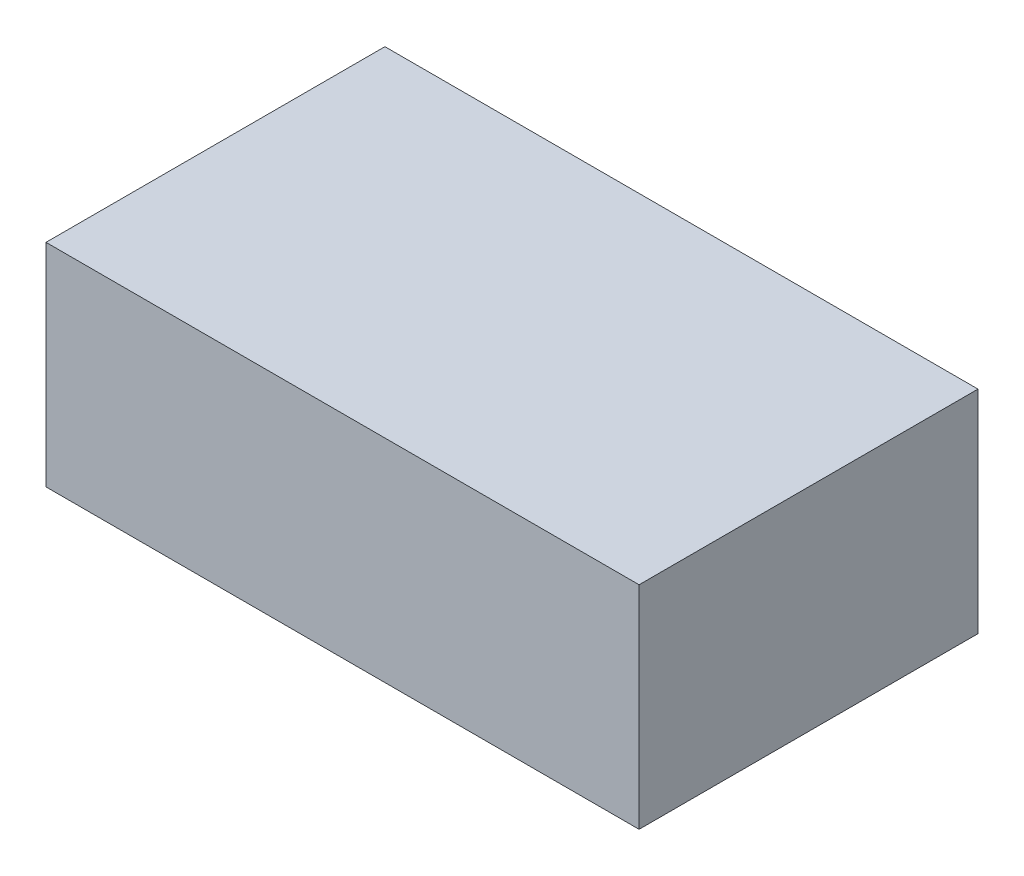
ISO-10303-21;
HEADER;
FILE_DESCRIPTION(('STEP AP214'),'2;1');
FILE_NAME('part.step','',(''),(''),'','','');
FILE_SCHEMA(('AUTOMOTIVE_DESIGN { 1 0 10303 214 1 1 1 1 }'));
ENDSEC;
DATA;
#1=APPLICATION_CONTEXT('core data for automotive mechanical design processes');
#2=APPLICATION_PROTOCOL_DEFINITION('international standard','automotive_design',2000,#1);
#3=PRODUCT_CONTEXT('',#1,'mechanical');
#4=PRODUCT('Part','Part','',(#3));
#5=PRODUCT_RELATED_PRODUCT_CATEGORY('part','',(#4));
#6=PRODUCT_DEFINITION_FORMATION('','',#4);
#7=PRODUCT_DEFINITION_CONTEXT('part definition',#1,'design');
#8=PRODUCT_DEFINITION('design','',#6,#7);
#9=PRODUCT_DEFINITION_SHAPE('','',#8);
#10=(LENGTH_UNIT() NAMED_UNIT(*) SI_UNIT(.MILLI.,.METRE.));
#11=(NAMED_UNIT(*) PLANE_ANGLE_UNIT() SI_UNIT($,.RADIAN.));
#12=(NAMED_UNIT(*) SI_UNIT($,.STERADIAN.) SOLID_ANGLE_UNIT());
#13=UNCERTAINTY_MEASURE_WITH_UNIT(LENGTH_MEASURE(1.E-05),#10,'distance_accuracy_value','');
#14=(GEOMETRIC_REPRESENTATION_CONTEXT(3) GLOBAL_UNCERTAINTY_ASSIGNED_CONTEXT((#13)) GLOBAL_UNIT_ASSIGNED_CONTEXT((#10,
#11,#12)) REPRESENTATION_CONTEXT('',''));
#15=CARTESIAN_POINT('',(0.,0.,0.));
#16=DIRECTION('',(0.,0.,1.));
#17=DIRECTION('',(1.,0.,0.));
#18=AXIS2_PLACEMENT_3D('',#15,#16,#17);
#19=CARTESIAN_POINT('',(0.,15.875,0.));
#20=DIRECTION('',(-1.,0.,0.));
#21=DIRECTION('',(0.,0.,1.));
#22=AXIS2_PLACEMENT_3D('',#19,#20,#21);
#23=PLANE('',#22);
#24=DIRECTION('',(0.,0.,-1.));
#25=VECTOR('',#24,1.);
#26=CARTESIAN_POINT('',(0.,0.,0.));
#27=LINE('',#26,#25);
#28=CARTESIAN_POINT('',(0.,0.,0.));
#29=VERTEX_POINT('',#28);
#30=CARTESIAN_POINT('',(0.,0.,-25.4));
#31=VERTEX_POINT('',#30);
#32=EDGE_CURVE('E100',#29,#31,#27,.T.);
#33=ORIENTED_EDGE('',*,*,#32,.T.);
#34=DIRECTION('',(0.,-1.,0.));
#35=VECTOR('',#34,1.);
#36=CARTESIAN_POINT('',(0.,15.875,-25.4));
#37=LINE('',#36,#35);
#38=CARTESIAN_POINT('',(0.,15.875,-25.4));
#39=VERTEX_POINT('',#38);
#40=EDGE_CURVE('E11',#39,#31,#37,.T.);
#41=ORIENTED_EDGE('',*,*,#40,.F.);
#42=DIRECTION('',(0.,0.,-1.));
#43=VECTOR('',#42,1.);
#44=CARTESIAN_POINT('',(0.,15.875,0.));
#45=LINE('',#44,#43);
#46=CARTESIAN_POINT('',(0.,15.875,0.));
#47=VERTEX_POINT('',#46);
#48=EDGE_CURVE('E88',#47,#39,#45,.T.);
#49=ORIENTED_EDGE('',*,*,#48,.F.);
#50=DIRECTION('',(0.,-1.,0.));
#51=VECTOR('',#50,1.);
#52=CARTESIAN_POINT('',(0.,15.875,0.));
#53=LINE('',#52,#51);
#54=EDGE_CURVE('E96',#47,#29,#53,.T.);
#55=ORIENTED_EDGE('',*,*,#54,.T.);
#56=EDGE_LOOP('',(#33,#41,#49,#55));
#57=FACE_BOUND('',#56,.T.);
#58=ADVANCED_FACE('F37',(#57),#23,.F.);
#59=CARTESIAN_POINT('',(0.,15.875,-25.4));
#60=DIRECTION('',(0.,0.,1.));
#61=DIRECTION('',(1.,0.,0.));
#62=AXIS2_PLACEMENT_3D('',#59,#60,#61);
#63=PLANE('',#62);
#64=DIRECTION('',(-1.,0.,0.));
#65=VECTOR('',#64,1.);
#66=CARTESIAN_POINT('',(0.,0.,-25.4));
#67=LINE('',#66,#65);
#68=CARTESIAN_POINT('',(-44.45,0.,-25.4));
#69=VERTEX_POINT('',#68);
#70=EDGE_CURVE('E92',#31,#69,#67,.T.);
#71=ORIENTED_EDGE('',*,*,#70,.T.);
#72=DIRECTION('',(0.,-1.,0.));
#73=VECTOR('',#72,1.);
#74=CARTESIAN_POINT('',(-44.45,15.875,-25.4));
#75=LINE('',#74,#73);
#76=CARTESIAN_POINT('',(-44.45,15.875,-25.4));
#77=VERTEX_POINT('',#76);
#78=EDGE_CURVE('E45',#77,#69,#75,.T.);
#79=ORIENTED_EDGE('',*,*,#78,.F.);
#80=DIRECTION('',(-1.,0.,0.));
#81=VECTOR('',#80,1.);
#82=CARTESIAN_POINT('',(0.,15.875,-25.4));
#83=LINE('',#82,#81);
#84=EDGE_CURVE('E83',#39,#77,#83,.T.);
#85=ORIENTED_EDGE('',*,*,#84,.F.);
#86=ORIENTED_EDGE('',*,*,#40,.T.);
#87=EDGE_LOOP('',(#71,#79,#85,#86));
#88=FACE_BOUND('',#87,.T.);
#89=ADVANCED_FACE('F91',(#88),#63,.F.);
#90=CARTESIAN_POINT('',(-44.45,15.875,0.));
#91=DIRECTION('',(1.,0.,0.));
#92=DIRECTION('',(0.,0.,-1.));
#93=AXIS2_PLACEMENT_3D('',#90,#91,#92);
#94=PLANE('',#93);
#95=DIRECTION('',(0.,0.,1.));
#96=VECTOR('',#95,1.);
#97=CARTESIAN_POINT('',(-44.45,0.,0.));
#98=LINE('',#97,#96);
#99=CARTESIAN_POINT('',(-44.45,0.,0.));
#100=VERTEX_POINT('',#99);
#101=EDGE_CURVE('E70',#69,#100,#98,.T.);
#102=ORIENTED_EDGE('',*,*,#101,.T.);
#103=DIRECTION('',(0.,-1.,0.));
#104=VECTOR('',#103,1.);
#105=CARTESIAN_POINT('',(-44.45,15.875,0.));
#106=LINE('',#105,#104);
#107=CARTESIAN_POINT('',(-44.45,15.875,0.));
#108=VERTEX_POINT('',#107);
#109=EDGE_CURVE('E93',#108,#100,#106,.T.);
#110=ORIENTED_EDGE('',*,*,#109,.F.);
#111=DIRECTION('',(0.,0.,1.));
#112=VECTOR('',#111,1.);
#113=CARTESIAN_POINT('',(-44.45,15.875,0.));
#114=LINE('',#113,#112);
#115=EDGE_CURVE('E86',#77,#108,#114,.T.);
#116=ORIENTED_EDGE('',*,*,#115,.F.);
#117=ORIENTED_EDGE('',*,*,#78,.T.);
#118=EDGE_LOOP('',(#102,#110,#116,#117));
#119=FACE_BOUND('',#118,.T.);
#120=ADVANCED_FACE('F94',(#119),#94,.F.);
#121=CARTESIAN_POINT('',(0.,15.875,0.));
#122=DIRECTION('',(0.,0.,-1.));
#123=DIRECTION('',(-1.,0.,0.));
#124=AXIS2_PLACEMENT_3D('',#121,#122,#123);
#125=PLANE('',#124);
#126=DIRECTION('',(1.,0.,0.));
#127=VECTOR('',#126,1.);
#128=CARTESIAN_POINT('',(0.,0.,0.));
#129=LINE('',#128,#127);
#130=EDGE_CURVE('E76',#100,#29,#129,.T.);
#131=ORIENTED_EDGE('',*,*,#130,.T.);
#132=ORIENTED_EDGE('',*,*,#54,.F.);
#133=DIRECTION('',(1.,0.,0.));
#134=VECTOR('',#133,1.);
#135=CARTESIAN_POINT('',(0.,15.875,0.));
#136=LINE('',#135,#134);
#137=EDGE_CURVE('E53',#108,#47,#136,.T.);
#138=ORIENTED_EDGE('',*,*,#137,.F.);
#139=ORIENTED_EDGE('',*,*,#109,.T.);
#140=EDGE_LOOP('',(#131,#132,#138,#139));
#141=FACE_BOUND('',#140,.T.);
#142=ADVANCED_FACE('F107',(#141),#125,.F.);
#143=CARTESIAN_POINT('',(0.,15.875,0.));
#144=DIRECTION('',(0.,1.,0.));
#145=DIRECTION('',(0.,0.,1.));
#146=AXIS2_PLACEMENT_3D('',#143,#144,#145);
#147=PLANE('',#146);
#148=ORIENTED_EDGE('',*,*,#48,.T.);
#149=ORIENTED_EDGE('',*,*,#84,.T.);
#150=ORIENTED_EDGE('',*,*,#115,.T.);
#151=ORIENTED_EDGE('',*,*,#137,.T.);
#152=EDGE_LOOP('',(#148,#149,#150,#151));
#153=FACE_BOUND('',#152,.T.);
#154=ADVANCED_FACE('F84',(#153),#147,.T.);
#155=CARTESIAN_POINT('',(0.,0.,0.));
#156=DIRECTION('',(0.,1.,0.));
#157=DIRECTION('',(0.,0.,1.));
#158=AXIS2_PLACEMENT_3D('',#155,#156,#157);
#159=PLANE('',#158);
#160=ORIENTED_EDGE('',*,*,#32,.F.);
#161=ORIENTED_EDGE('',*,*,#130,.F.);
#162=ORIENTED_EDGE('',*,*,#101,.F.);
#163=ORIENTED_EDGE('',*,*,#70,.F.);
#164=EDGE_LOOP('',(#160,#161,#162,#163));
#165=FACE_BOUND('',#164,.T.);
#166=ADVANCED_FACE('F110',(#165),#159,.F.);
#167=CLOSED_SHELL('',(#58,#89,#120,#142,#154,#166));
#168=MANIFOLD_SOLID_BREP('B2',#167);
#169=ADVANCED_BREP_SHAPE_REPRESENTATION('',(#18,#168),#14);
#170=SHAPE_DEFINITION_REPRESENTATION(#9,#169);
ENDSEC;
END-ISO-10303-21;
